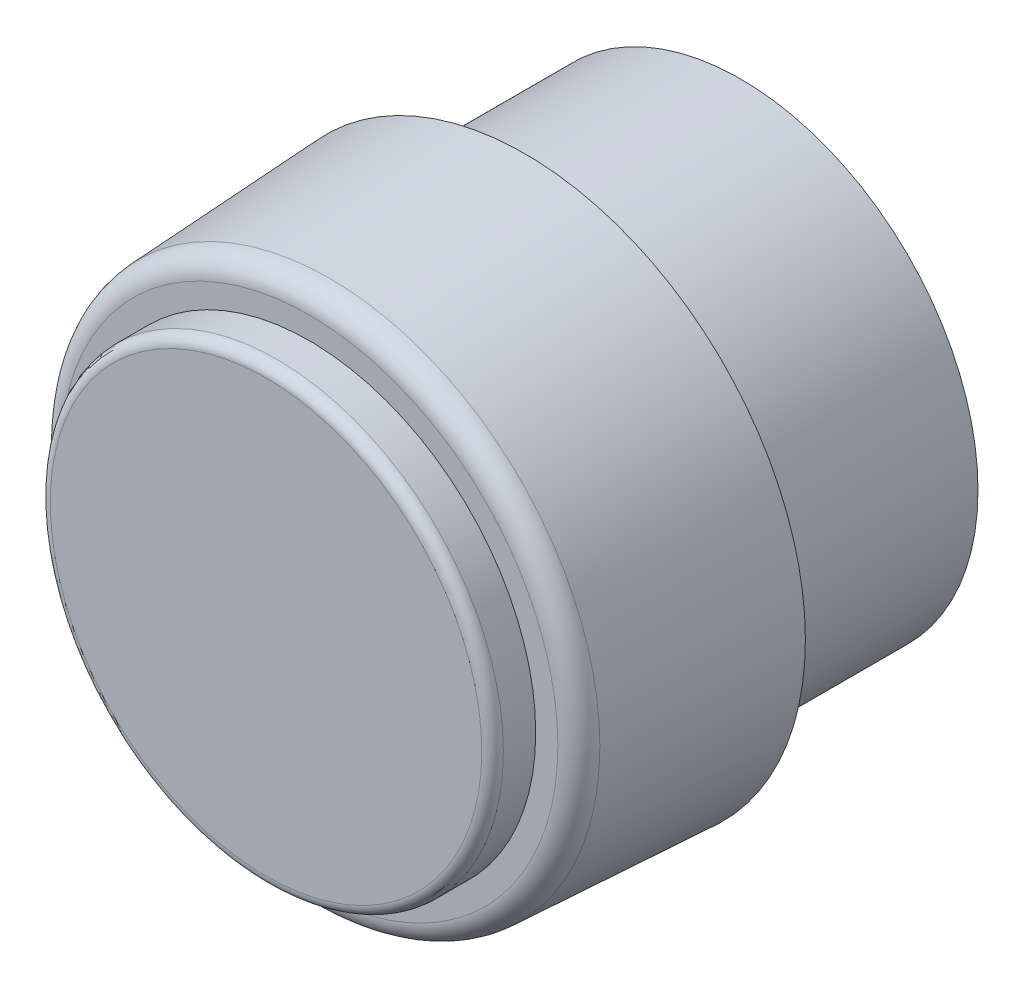
ISO-10303-21;
HEADER;
FILE_DESCRIPTION(('STEP AP214'),'2;1');
FILE_NAME('part.step','',(''),(''),'','','');
FILE_SCHEMA(('AUTOMOTIVE_DESIGN { 1 0 10303 214 1 1 1 1 }'));
ENDSEC;
DATA;
#1=APPLICATION_CONTEXT('core data for automotive mechanical design processes');
#2=APPLICATION_PROTOCOL_DEFINITION('international standard','automotive_design',2000,#1);
#3=PRODUCT_CONTEXT('',#1,'mechanical');
#4=PRODUCT('Part','Part','',(#3));
#5=PRODUCT_RELATED_PRODUCT_CATEGORY('part','',(#4));
#6=PRODUCT_DEFINITION_FORMATION('','',#4);
#7=PRODUCT_DEFINITION_CONTEXT('part definition',#1,'design');
#8=PRODUCT_DEFINITION('design','',#6,#7);
#9=PRODUCT_DEFINITION_SHAPE('','',#8);
#10=(LENGTH_UNIT() NAMED_UNIT(*) SI_UNIT(.MILLI.,.METRE.));
#11=(NAMED_UNIT(*) PLANE_ANGLE_UNIT() SI_UNIT($,.RADIAN.));
#12=(NAMED_UNIT(*) SI_UNIT($,.STERADIAN.) SOLID_ANGLE_UNIT());
#13=UNCERTAINTY_MEASURE_WITH_UNIT(LENGTH_MEASURE(1.E-05),#10,'distance_accuracy_value','');
#14=(GEOMETRIC_REPRESENTATION_CONTEXT(3) GLOBAL_UNCERTAINTY_ASSIGNED_CONTEXT((#13)) GLOBAL_UNIT_ASSIGNED_CONTEXT((#10,
#11,#12)) REPRESENTATION_CONTEXT('',''));
#15=CARTESIAN_POINT('',(0.,0.,0.));
#16=DIRECTION('',(0.,0.,1.));
#17=DIRECTION('',(1.,0.,0.));
#18=AXIS2_PLACEMENT_3D('',#15,#16,#17);
#19=CARTESIAN_POINT('',(0.,0.,20.));
#20=DIRECTION('',(0.,0.,1.));
#21=DIRECTION('',(1.,0.,0.));
#22=AXIS2_PLACEMENT_3D('',#19,#20,#21);
#23=PLANE('',#22);
#24=CARTESIAN_POINT('',(0.,0.,20.));
#25=DIRECTION('',(0.,0.,1.));
#26=DIRECTION('',(1.,0.,0.));
#27=AXIS2_PLACEMENT_3D('',#24,#25,#26);
#28=CIRCLE('',#27,11.5269576404547);
#29=CARTESIAN_POINT('',(11.5269576404547,0.,20.));
#30=VERTEX_POINT('',#29);
#31=EDGE_CURVE('E46',#30,#30,#28,.T.);
#32=ORIENTED_EDGE('',*,*,#31,.T.);
#33=EDGE_LOOP('',(#32));
#34=FACE_BOUND('',#33,.T.);
#35=CARTESIAN_POINT('',(0.,0.,20.));
#36=DIRECTION('',(0.,0.,1.));
#37=DIRECTION('',(1.,0.,0.));
#38=AXIS2_PLACEMENT_3D('',#35,#36,#37);
#39=CIRCLE('',#38,10.5);
#40=CARTESIAN_POINT('',(10.5,0.,20.));
#41=VERTEX_POINT('',#40);
#42=EDGE_CURVE('E60',#41,#41,#39,.T.);
#43=ORIENTED_EDGE('',*,*,#42,.F.);
#44=EDGE_LOOP('',(#43));
#45=FACE_BOUND('',#44,.T.);
#46=ADVANCED_FACE('F31',(#34,#45),#23,.T.);
#47=CARTESIAN_POINT('',(0.,0.,10.));
#48=DIRECTION('',(0.,0.,-1.));
#49=DIRECTION('',(-1.,0.,0.));
#50=AXIS2_PLACEMENT_3D('',#47,#48,#49);
#51=CYLINDRICAL_SURFACE('',#50,11.);
#52=CARTESIAN_POINT('',(0.,0.,10.));
#53=DIRECTION('',(0.,0.,1.));
#54=DIRECTION('',(1.,0.,0.));
#55=AXIS2_PLACEMENT_3D('',#52,#53,#54);
#56=CIRCLE('',#55,11.);
#57=CARTESIAN_POINT('',(11.,0.,10.));
#58=VERTEX_POINT('',#57);
#59=EDGE_CURVE('E51',#58,#58,#56,.T.);
#60=ORIENTED_EDGE('',*,*,#59,.F.);
#61=EDGE_LOOP('',(#60));
#62=FACE_BOUND('',#61,.T.);
#63=CARTESIAN_POINT('',(0.,0.,0.));
#64=DIRECTION('',(0.,0.,1.));
#65=DIRECTION('',(1.,0.,0.));
#66=AXIS2_PLACEMENT_3D('',#63,#64,#65);
#67=CIRCLE('',#66,11.);
#68=CARTESIAN_POINT('',(11.,0.,0.));
#69=VERTEX_POINT('',#68);
#70=EDGE_CURVE('E52',#69,#69,#67,.T.);
#71=ORIENTED_EDGE('',*,*,#70,.T.);
#72=EDGE_LOOP('',(#71));
#73=FACE_BOUND('',#72,.T.);
#74=ADVANCED_FACE('F67',(#62,#73),#51,.T.);
#75=CARTESIAN_POINT('',(0.,0.,0.));
#76=DIRECTION('',(0.,0.,1.));
#77=DIRECTION('',(1.,0.,0.));
#78=AXIS2_PLACEMENT_3D('',#75,#76,#77);
#79=PLANE('',#78);
#80=ORIENTED_EDGE('',*,*,#70,.F.);
#81=EDGE_LOOP('',(#80));
#82=FACE_BOUND('',#81,.T.);
#83=ADVANCED_FACE('F73',(#82),#79,.F.);
#84=CARTESIAN_POINT('',(0.,0.,10.));
#85=DIRECTION('',(0.,0.,1.));
#86=DIRECTION('',(1.,0.,0.));
#87=AXIS2_PLACEMENT_3D('',#84,#85,#86);
#88=PLANE('',#87);
#89=CARTESIAN_POINT('',(0.,0.,10.));
#90=DIRECTION('',(0.,0.,1.));
#91=DIRECTION('',(1.,0.,0.));
#92=AXIS2_PLACEMENT_3D('',#89,#90,#91);
#93=CIRCLE('',#92,13.);
#94=CARTESIAN_POINT('',(13.,0.,10.));
#95=VERTEX_POINT('',#94);
#96=EDGE_CURVE('E55',#95,#95,#93,.T.);
#97=ORIENTED_EDGE('',*,*,#96,.F.);
#98=EDGE_LOOP('',(#97));
#99=FACE_BOUND('',#98,.T.);
#100=ORIENTED_EDGE('',*,*,#59,.T.);
#101=EDGE_LOOP('',(#100));
#102=FACE_BOUND('',#101,.T.);
#103=ADVANCED_FACE('F79',(#99,#102),#88,.F.);
#104=CARTESIAN_POINT('',(0.,0.,10.));
#105=DIRECTION('',(0.,0.,-1.));
#106=DIRECTION('',(1.,0.,0.));
#107=AXIS2_PLACEMENT_3D('',#104,#105,#106);
#108=CONICAL_SURFACE('',#107,13.,0.05235987755983);
#109=CARTESIAN_POINT('',(0.,0.,19.0523359562429));
#110=DIRECTION('',(0.,0.,-1.));
#111=DIRECTION('',(-1.,0.,0.));
#112=AXIS2_PLACEMENT_3D('',#109,#110,#111);
#113=CIRCLE('',#112,12.5255871752093);
#114=CARTESIAN_POINT('',(-12.5255871752093,0.,19.0523359562429));
#115=VERTEX_POINT('',#114);
#116=EDGE_CURVE('E42',#115,#115,#113,.T.);
#117=ORIENTED_EDGE('',*,*,#116,.T.);
#118=EDGE_LOOP('',(#117));
#119=FACE_BOUND('',#118,.T.);
#120=ORIENTED_EDGE('',*,*,#96,.T.);
#121=EDGE_LOOP('',(#120));
#122=FACE_BOUND('',#121,.T.);
#123=ADVANCED_FACE('F82',(#119,#122),#108,.T.);
#124=CARTESIAN_POINT('',(0.,0.,19.));
#125=DIRECTION('',(0.,0.,1.));
#126=DIRECTION('',(1.,0.,0.));
#127=AXIS2_PLACEMENT_3D('',#124,#125,#126);
#128=TOROIDAL_SURFACE('',#127,11.5269576404547,1.);
#129=ORIENTED_EDGE('',*,*,#116,.F.);
#130=EDGE_LOOP('',(#129));
#131=FACE_BOUND('',#130,.T.);
#132=ORIENTED_EDGE('',*,*,#31,.F.);
#133=EDGE_LOOP('',(#132));
#134=FACE_BOUND('',#133,.T.);
#135=ADVANCED_FACE('F86',(#131,#134),#128,.T.);
#136=CARTESIAN_POINT('',(0.,0.,22.));
#137=DIRECTION('',(0.,0.,-1.));
#138=DIRECTION('',(-1.,0.,0.));
#139=AXIS2_PLACEMENT_3D('',#136,#137,#138);
#140=CYLINDRICAL_SURFACE('',#139,10.5);
#141=CARTESIAN_POINT('',(0.,0.,21.5));
#142=DIRECTION('',(0.,0.,1.));
#143=DIRECTION('',(1.,0.,0.));
#144=AXIS2_PLACEMENT_3D('',#141,#142,#143);
#145=CIRCLE('',#144,10.5);
#146=CARTESIAN_POINT('',(10.5,0.,21.5));
#147=VERTEX_POINT('',#146);
#148=EDGE_CURVE('E10',#147,#147,#145,.F.);
#149=ORIENTED_EDGE('',*,*,#148,.T.);
#150=EDGE_LOOP('',(#149));
#151=FACE_BOUND('',#150,.T.);
#152=ORIENTED_EDGE('',*,*,#42,.T.);
#153=EDGE_LOOP('',(#152));
#154=FACE_BOUND('',#153,.T.);
#155=ADVANCED_FACE('F64',(#151,#154),#140,.T.);
#156=CARTESIAN_POINT('',(0.,0.,22.));
#157=DIRECTION('',(0.,0.,1.));
#158=DIRECTION('',(1.,0.,0.));
#159=AXIS2_PLACEMENT_3D('',#156,#157,#158);
#160=PLANE('',#159);
#161=CARTESIAN_POINT('',(0.,0.,22.));
#162=DIRECTION('',(0.,0.,1.));
#163=DIRECTION('',(1.,0.,0.));
#164=AXIS2_PLACEMENT_3D('',#161,#162,#163);
#165=CIRCLE('',#164,10.);
#166=CARTESIAN_POINT('',(10.,0.,22.));
#167=VERTEX_POINT('',#166);
#168=EDGE_CURVE('E38',#167,#167,#165,.T.);
#169=ORIENTED_EDGE('',*,*,#168,.T.);
#170=EDGE_LOOP('',(#169));
#171=FACE_BOUND('',#170,.T.);
#172=ADVANCED_FACE('F95',(#171),#160,.T.);
#173=CARTESIAN_POINT('',(0.,0.,21.5));
#174=DIRECTION('',(0.,0.,1.));
#175=DIRECTION('',(1.,0.,0.));
#176=AXIS2_PLACEMENT_3D('',#173,#174,#175);
#177=TOROIDAL_SURFACE('',#176,10.,0.5);
#178=ORIENTED_EDGE('',*,*,#148,.F.);
#179=EDGE_LOOP('',(#178));
#180=FACE_BOUND('',#179,.T.);
#181=ORIENTED_EDGE('',*,*,#168,.F.);
#182=EDGE_LOOP('',(#181));
#183=FACE_BOUND('',#182,.T.);
#184=ADVANCED_FACE('F33',(#180,#183),#177,.T.);
#185=CLOSED_SHELL('',(#46,#74,#83,#103,#123,#135,#155,#172,#184));
#186=MANIFOLD_SOLID_BREP('B2',#185);
#187=ADVANCED_BREP_SHAPE_REPRESENTATION('',(#18,#186),#14);
#188=SHAPE_DEFINITION_REPRESENTATION(#9,#187);
ENDSEC;
END-ISO-10303-21;
